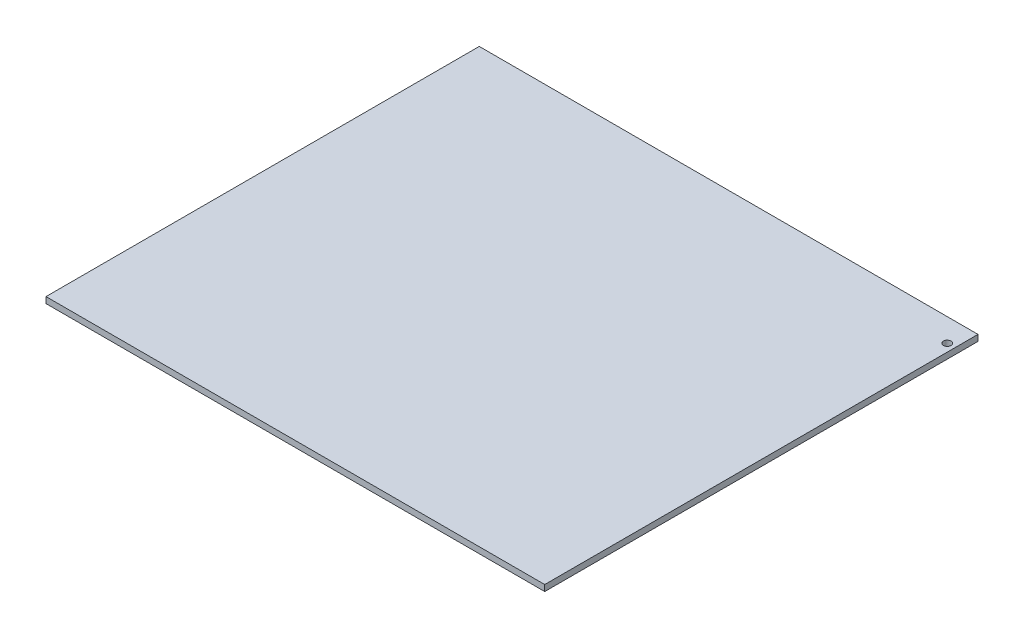
ISO-10303-21;
HEADER;
FILE_DESCRIPTION(('STEP AP214'),'2;1');
FILE_NAME('part.step','',(''),(''),'','','');
FILE_SCHEMA(('AUTOMOTIVE_DESIGN { 1 0 10303 214 1 1 1 1 }'));
ENDSEC;
DATA;
#1=APPLICATION_CONTEXT('core data for automotive mechanical design processes');
#2=APPLICATION_PROTOCOL_DEFINITION('international standard','automotive_design',2000,#1);
#3=PRODUCT_CONTEXT('',#1,'mechanical');
#4=PRODUCT('Part','Part','',(#3));
#5=PRODUCT_RELATED_PRODUCT_CATEGORY('part','',(#4));
#6=PRODUCT_DEFINITION_FORMATION('','',#4);
#7=PRODUCT_DEFINITION_CONTEXT('part definition',#1,'design');
#8=PRODUCT_DEFINITION('design','',#6,#7);
#9=PRODUCT_DEFINITION_SHAPE('','',#8);
#10=(LENGTH_UNIT() NAMED_UNIT(*) SI_UNIT(.MILLI.,.METRE.));
#11=(NAMED_UNIT(*) PLANE_ANGLE_UNIT() SI_UNIT($,.RADIAN.));
#12=(NAMED_UNIT(*) SI_UNIT($,.STERADIAN.) SOLID_ANGLE_UNIT());
#13=UNCERTAINTY_MEASURE_WITH_UNIT(LENGTH_MEASURE(1.E-05),#10,'distance_accuracy_value','');
#14=(GEOMETRIC_REPRESENTATION_CONTEXT(3) GLOBAL_UNCERTAINTY_ASSIGNED_CONTEXT((#13)) GLOBAL_UNIT_ASSIGNED_CONTEXT((#10,
#11,#12)) REPRESENTATION_CONTEXT('',''));
#15=CARTESIAN_POINT('',(0.,0.,0.));
#16=DIRECTION('',(0.,0.,1.));
#17=DIRECTION('',(1.,0.,0.));
#18=AXIS2_PLACEMENT_3D('',#15,#16,#17);
#19=CARTESIAN_POINT('',(129.5,3.175,-112.5));
#20=DIRECTION('',(-1.,0.,0.));
#21=DIRECTION('',(0.,0.,1.));
#22=AXIS2_PLACEMENT_3D('',#19,#20,#21);
#23=PLANE('',#22);
#24=DIRECTION('',(0.,0.,-1.));
#25=VECTOR('',#24,1.);
#26=CARTESIAN_POINT('',(129.5,0.,-112.5));
#27=LINE('',#26,#25);
#28=CARTESIAN_POINT('',(129.5,0.,112.5));
#29=VERTEX_POINT('',#28);
#30=CARTESIAN_POINT('',(129.5,0.,-112.5));
#31=VERTEX_POINT('',#30);
#32=EDGE_CURVE('E106',#29,#31,#27,.T.);
#33=ORIENTED_EDGE('',*,*,#32,.T.);
#34=DIRECTION('',(0.,-1.,0.));
#35=VECTOR('',#34,1.);
#36=CARTESIAN_POINT('',(129.5,3.175,-112.5));
#37=LINE('',#36,#35);
#38=CARTESIAN_POINT('',(129.5,3.175,-112.5));
#39=VERTEX_POINT('',#38);
#40=EDGE_CURVE('E11',#39,#31,#37,.T.);
#41=ORIENTED_EDGE('',*,*,#40,.F.);
#42=DIRECTION('',(0.,0.,-1.));
#43=VECTOR('',#42,1.);
#44=CARTESIAN_POINT('',(129.5,3.175,-112.5));
#45=LINE('',#44,#43);
#46=CARTESIAN_POINT('',(129.5,3.175,112.5));
#47=VERTEX_POINT('',#46);
#48=EDGE_CURVE('E93',#47,#39,#45,.T.);
#49=ORIENTED_EDGE('',*,*,#48,.F.);
#50=DIRECTION('',(0.,-1.,0.));
#51=VECTOR('',#50,1.);
#52=CARTESIAN_POINT('',(129.5,3.175,112.5));
#53=LINE('',#52,#51);
#54=EDGE_CURVE('E102',#47,#29,#53,.T.);
#55=ORIENTED_EDGE('',*,*,#54,.T.);
#56=EDGE_LOOP('',(#33,#41,#49,#55));
#57=FACE_BOUND('',#56,.T.);
#58=ADVANCED_FACE('F41',(#57),#23,.F.);
#59=CARTESIAN_POINT('',(-129.5,3.175,-112.5));
#60=DIRECTION('',(0.,0.,1.));
#61=DIRECTION('',(1.,0.,0.));
#62=AXIS2_PLACEMENT_3D('',#59,#60,#61);
#63=PLANE('',#62);
#64=DIRECTION('',(-1.,0.,0.));
#65=VECTOR('',#64,1.);
#66=CARTESIAN_POINT('',(-129.5,0.,-112.5));
#67=LINE('',#66,#65);
#68=CARTESIAN_POINT('',(-129.5,0.,-112.5));
#69=VERTEX_POINT('',#68);
#70=EDGE_CURVE('E97',#31,#69,#67,.T.);
#71=ORIENTED_EDGE('',*,*,#70,.T.);
#72=DIRECTION('',(0.,-1.,0.));
#73=VECTOR('',#72,1.);
#74=CARTESIAN_POINT('',(-129.5,3.175,-112.5));
#75=LINE('',#74,#73);
#76=CARTESIAN_POINT('',(-129.5,3.175,-112.5));
#77=VERTEX_POINT('',#76);
#78=EDGE_CURVE('E50',#77,#69,#75,.T.);
#79=ORIENTED_EDGE('',*,*,#78,.F.);
#80=DIRECTION('',(-1.,0.,0.));
#81=VECTOR('',#80,1.);
#82=CARTESIAN_POINT('',(-129.5,3.175,-112.5));
#83=LINE('',#82,#81);
#84=EDGE_CURVE('E88',#39,#77,#83,.T.);
#85=ORIENTED_EDGE('',*,*,#84,.F.);
#86=ORIENTED_EDGE('',*,*,#40,.T.);
#87=EDGE_LOOP('',(#71,#79,#85,#86));
#88=FACE_BOUND('',#87,.T.);
#89=ADVANCED_FACE('F96',(#88),#63,.F.);
#90=CARTESIAN_POINT('',(-129.5,3.175,-112.5));
#91=DIRECTION('',(1.,0.,0.));
#92=DIRECTION('',(0.,0.,-1.));
#93=AXIS2_PLACEMENT_3D('',#90,#91,#92);
#94=PLANE('',#93);
#95=DIRECTION('',(0.,0.,1.));
#96=VECTOR('',#95,1.);
#97=CARTESIAN_POINT('',(-129.5,0.,-112.5));
#98=LINE('',#97,#96);
#99=CARTESIAN_POINT('',(-129.5,0.,112.5));
#100=VERTEX_POINT('',#99);
#101=EDGE_CURVE('E75',#69,#100,#98,.T.);
#102=ORIENTED_EDGE('',*,*,#101,.T.);
#103=DIRECTION('',(0.,-1.,0.));
#104=VECTOR('',#103,1.);
#105=CARTESIAN_POINT('',(-129.5,3.175,112.5));
#106=LINE('',#105,#104);
#107=CARTESIAN_POINT('',(-129.5,3.175,112.5));
#108=VERTEX_POINT('',#107);
#109=EDGE_CURVE('E98',#108,#100,#106,.T.);
#110=ORIENTED_EDGE('',*,*,#109,.F.);
#111=DIRECTION('',(0.,0.,1.));
#112=VECTOR('',#111,1.);
#113=CARTESIAN_POINT('',(-129.5,3.175,-112.5));
#114=LINE('',#113,#112);
#115=EDGE_CURVE('E91',#77,#108,#114,.T.);
#116=ORIENTED_EDGE('',*,*,#115,.F.);
#117=ORIENTED_EDGE('',*,*,#78,.T.);
#118=EDGE_LOOP('',(#102,#110,#116,#117));
#119=FACE_BOUND('',#118,.T.);
#120=ADVANCED_FACE('F100',(#119),#94,.F.);
#121=CARTESIAN_POINT('',(-129.5,3.175,112.5));
#122=DIRECTION('',(0.,0.,-1.));
#123=DIRECTION('',(-1.,0.,0.));
#124=AXIS2_PLACEMENT_3D('',#121,#122,#123);
#125=PLANE('',#124);
#126=DIRECTION('',(1.,0.,0.));
#127=VECTOR('',#126,1.);
#128=CARTESIAN_POINT('',(-129.5,0.,112.5));
#129=LINE('',#128,#127);
#130=EDGE_CURVE('E81',#100,#29,#129,.T.);
#131=ORIENTED_EDGE('',*,*,#130,.T.);
#132=ORIENTED_EDGE('',*,*,#54,.F.);
#133=DIRECTION('',(1.,0.,0.));
#134=VECTOR('',#133,1.);
#135=CARTESIAN_POINT('',(-129.5,3.175,112.5));
#136=LINE('',#135,#134);
#137=EDGE_CURVE('E58',#108,#47,#136,.T.);
#138=ORIENTED_EDGE('',*,*,#137,.F.);
#139=ORIENTED_EDGE('',*,*,#109,.T.);
#140=EDGE_LOOP('',(#131,#132,#138,#139));
#141=FACE_BOUND('',#140,.T.);
#142=ADVANCED_FACE('F114',(#141),#125,.F.);
#143=CARTESIAN_POINT('',(0.,3.175,0.));
#144=DIRECTION('',(0.,1.,0.));
#145=DIRECTION('',(0.,0.,1.));
#146=AXIS2_PLACEMENT_3D('',#143,#144,#145);
#147=PLANE('',#146);
#148=CARTESIAN_POINT('',(125.5,3.175,-100.5));
#149=DIRECTION('',(0.,1.,0.));
#150=DIRECTION('',(0.,0.,1.));
#151=AXIS2_PLACEMENT_3D('',#148,#149,#150);
#152=CIRCLE('',#151,2.);
#153=CARTESIAN_POINT('',(125.5,3.175,-98.5));
#154=VERTEX_POINT('',#153);
#155=EDGE_CURVE('E109',#154,#154,#152,.T.);
#156=ORIENTED_EDGE('',*,*,#155,.F.);
#157=EDGE_LOOP('',(#156));
#158=FACE_BOUND('',#157,.T.);
#159=ORIENTED_EDGE('',*,*,#48,.T.);
#160=ORIENTED_EDGE('',*,*,#84,.T.);
#161=ORIENTED_EDGE('',*,*,#115,.T.);
#162=ORIENTED_EDGE('',*,*,#137,.T.);
#163=EDGE_LOOP('',(#159,#160,#161,#162));
#164=FACE_BOUND('',#163,.T.);
#165=ADVANCED_FACE('F89',(#158,#164),#147,.T.);
#166=CARTESIAN_POINT('',(0.,0.,0.));
#167=DIRECTION('',(0.,1.,0.));
#168=DIRECTION('',(0.,0.,1.));
#169=AXIS2_PLACEMENT_3D('',#166,#167,#168);
#170=PLANE('',#169);
#171=CARTESIAN_POINT('',(125.5,0.,-100.5));
#172=DIRECTION('',(0.,1.,0.));
#173=DIRECTION('',(0.,0.,1.));
#174=AXIS2_PLACEMENT_3D('',#171,#172,#173);
#175=CIRCLE('',#174,2.);
#176=CARTESIAN_POINT('',(125.5,0.,-98.5));
#177=VERTEX_POINT('',#176);
#178=EDGE_CURVE('E44',#177,#177,#175,.T.);
#179=ORIENTED_EDGE('',*,*,#178,.T.);
#180=EDGE_LOOP('',(#179));
#181=FACE_BOUND('',#180,.T.);
#182=ORIENTED_EDGE('',*,*,#32,.F.);
#183=ORIENTED_EDGE('',*,*,#130,.F.);
#184=ORIENTED_EDGE('',*,*,#101,.F.);
#185=ORIENTED_EDGE('',*,*,#70,.F.);
#186=EDGE_LOOP('',(#182,#183,#184,#185));
#187=FACE_BOUND('',#186,.T.);
#188=ADVANCED_FACE('F117',(#181,#187),#170,.F.);
#189=CARTESIAN_POINT('',(125.5,-1.825,-100.5));
#190=DIRECTION('',(0.,1.,0.));
#191=DIRECTION('',(0.,0.,1.));
#192=AXIS2_PLACEMENT_3D('',#189,#190,#191);
#193=CYLINDRICAL_SURFACE('',#192,2.);
#194=ORIENTED_EDGE('',*,*,#155,.T.);
#195=EDGE_LOOP('',(#194));
#196=FACE_BOUND('',#195,.T.);
#197=ORIENTED_EDGE('',*,*,#178,.F.);
#198=EDGE_LOOP('',(#197));
#199=FACE_BOUND('',#198,.T.);
#200=ADVANCED_FACE('F127',(#196,#199),#193,.F.);
#201=CLOSED_SHELL('',(#58,#89,#120,#142,#165,#188,#200));
#202=MANIFOLD_SOLID_BREP('B2',#201);
#203=ADVANCED_BREP_SHAPE_REPRESENTATION('',(#18,#202),#14);
#204=SHAPE_DEFINITION_REPRESENTATION(#9,#203);
ENDSEC;
END-ISO-10303-21;
